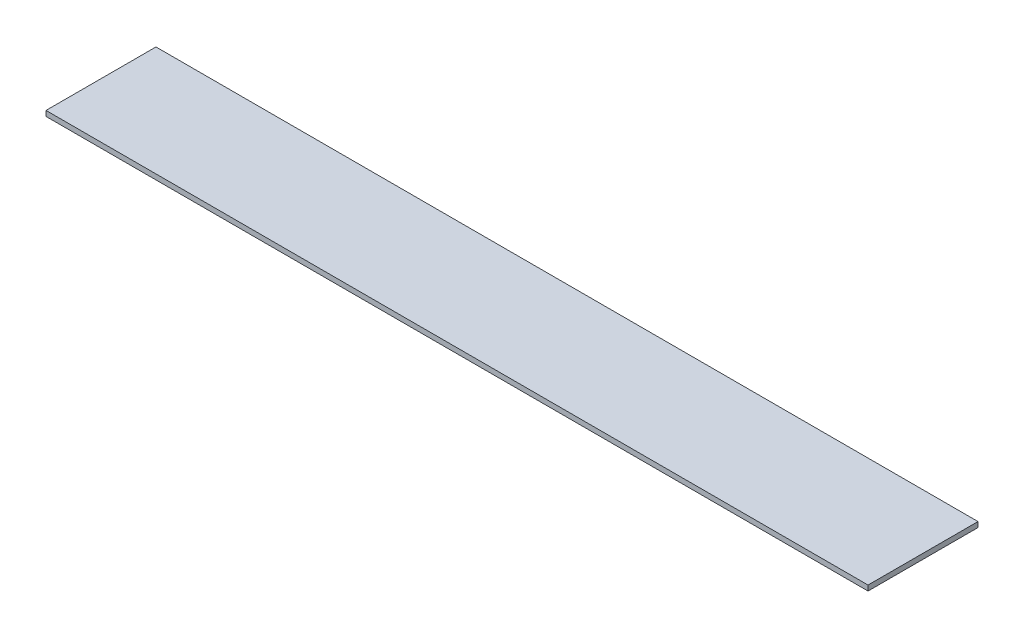
ISO-10303-21;
HEADER;
FILE_DESCRIPTION(('STEP AP214'),'2;1');
FILE_NAME('part.step','',(''),(''),'','','');
FILE_SCHEMA(('AUTOMOTIVE_DESIGN { 1 0 10303 214 1 1 1 1 }'));
ENDSEC;
DATA;
#1=APPLICATION_CONTEXT('core data for automotive mechanical design processes');
#2=APPLICATION_PROTOCOL_DEFINITION('international standard','automotive_design',2000,#1);
#3=PRODUCT_CONTEXT('',#1,'mechanical');
#4=PRODUCT('Part','Part','',(#3));
#5=PRODUCT_RELATED_PRODUCT_CATEGORY('part','',(#4));
#6=PRODUCT_DEFINITION_FORMATION('','',#4);
#7=PRODUCT_DEFINITION_CONTEXT('part definition',#1,'design');
#8=PRODUCT_DEFINITION('design','',#6,#7);
#9=PRODUCT_DEFINITION_SHAPE('','',#8);
#10=(LENGTH_UNIT() NAMED_UNIT(*) SI_UNIT(.MILLI.,.METRE.));
#11=(NAMED_UNIT(*) PLANE_ANGLE_UNIT() SI_UNIT($,.RADIAN.));
#12=(NAMED_UNIT(*) SI_UNIT($,.STERADIAN.) SOLID_ANGLE_UNIT());
#13=UNCERTAINTY_MEASURE_WITH_UNIT(LENGTH_MEASURE(1.E-05),#10,'distance_accuracy_value','');
#14=(GEOMETRIC_REPRESENTATION_CONTEXT(3) GLOBAL_UNCERTAINTY_ASSIGNED_CONTEXT((#13)) GLOBAL_UNIT_ASSIGNED_CONTEXT((#10,
#11,#12)) REPRESENTATION_CONTEXT('',''));
#15=CARTESIAN_POINT('',(0.,0.,0.));
#16=DIRECTION('',(0.,0.,1.));
#17=DIRECTION('',(1.,0.,0.));
#18=AXIS2_PLACEMENT_3D('',#15,#16,#17);
#19=CARTESIAN_POINT('',(0.,1.,-21.));
#20=DIRECTION('',(1.,0.,0.));
#21=DIRECTION('',(0.,0.,-1.));
#22=AXIS2_PLACEMENT_3D('',#19,#20,#21);
#23=PLANE('',#22);
#24=DIRECTION('',(0.,0.,1.));
#25=VECTOR('',#24,1.);
#26=CARTESIAN_POINT('',(0.,0.,-21.));
#27=LINE('',#26,#25);
#28=CARTESIAN_POINT('',(0.,0.,-21.));
#29=VERTEX_POINT('',#28);
#30=CARTESIAN_POINT('',(0.,0.,0.));
#31=VERTEX_POINT('',#30);
#32=EDGE_CURVE('E99',#29,#31,#27,.T.);
#33=ORIENTED_EDGE('',*,*,#32,.F.);
#34=DIRECTION('',(0.,-1.,0.));
#35=VECTOR('',#34,1.);
#36=CARTESIAN_POINT('',(0.,1.,-21.));
#37=LINE('',#36,#35);
#38=CARTESIAN_POINT('',(0.,1.,-21.));
#39=VERTEX_POINT('',#38);
#40=EDGE_CURVE('E11',#39,#29,#37,.T.);
#41=ORIENTED_EDGE('',*,*,#40,.F.);
#42=DIRECTION('',(0.,0.,1.));
#43=VECTOR('',#42,1.);
#44=CARTESIAN_POINT('',(0.,1.,-21.));
#45=LINE('',#44,#43);
#46=CARTESIAN_POINT('',(0.,1.,0.));
#47=VERTEX_POINT('',#46);
#48=EDGE_CURVE('E93',#39,#47,#45,.T.);
#49=ORIENTED_EDGE('',*,*,#48,.T.);
#50=DIRECTION('',(0.,-1.,0.));
#51=VECTOR('',#50,1.);
#52=CARTESIAN_POINT('',(0.,1.,0.));
#53=LINE('',#52,#51);
#54=EDGE_CURVE('E38',#47,#31,#53,.T.);
#55=ORIENTED_EDGE('',*,*,#54,.T.);
#56=EDGE_LOOP('',(#33,#41,#49,#55));
#57=FACE_BOUND('',#56,.T.);
#58=ADVANCED_FACE('F35',(#57),#23,.T.);
#59=CARTESIAN_POINT('',(-157.,1.,-21.));
#60=DIRECTION('',(0.,0.,-1.));
#61=DIRECTION('',(-1.,0.,0.));
#62=AXIS2_PLACEMENT_3D('',#59,#60,#61);
#63=PLANE('',#62);
#64=DIRECTION('',(1.,0.,0.));
#65=VECTOR('',#64,1.);
#66=CARTESIAN_POINT('',(-157.,0.,-21.));
#67=LINE('',#66,#65);
#68=CARTESIAN_POINT('',(-157.,0.,-21.));
#69=VERTEX_POINT('',#68);
#70=EDGE_CURVE('E95',#69,#29,#67,.T.);
#71=ORIENTED_EDGE('',*,*,#70,.F.);
#72=DIRECTION('',(0.,-1.,0.));
#73=VECTOR('',#72,1.);
#74=CARTESIAN_POINT('',(-157.,1.,-21.));
#75=LINE('',#74,#73);
#76=CARTESIAN_POINT('',(-157.,1.,-21.));
#77=VERTEX_POINT('',#76);
#78=EDGE_CURVE('E44',#77,#69,#75,.T.);
#79=ORIENTED_EDGE('',*,*,#78,.F.);
#80=DIRECTION('',(1.,0.,0.));
#81=VECTOR('',#80,1.);
#82=CARTESIAN_POINT('',(-157.,1.,-21.));
#83=LINE('',#82,#81);
#84=EDGE_CURVE('E90',#77,#39,#83,.T.);
#85=ORIENTED_EDGE('',*,*,#84,.T.);
#86=ORIENTED_EDGE('',*,*,#40,.T.);
#87=EDGE_LOOP('',(#71,#79,#85,#86));
#88=FACE_BOUND('',#87,.T.);
#89=ADVANCED_FACE('F109',(#88),#63,.T.);
#90=CARTESIAN_POINT('',(-157.,1.,0.));
#91=DIRECTION('',(-1.,0.,0.));
#92=DIRECTION('',(0.,0.,1.));
#93=AXIS2_PLACEMENT_3D('',#90,#91,#92);
#94=PLANE('',#93);
#95=DIRECTION('',(0.,0.,-1.));
#96=VECTOR('',#95,1.);
#97=CARTESIAN_POINT('',(-157.,0.,0.));
#98=LINE('',#97,#96);
#99=CARTESIAN_POINT('',(-157.,0.,0.));
#100=VERTEX_POINT('',#99);
#101=EDGE_CURVE('E85',#100,#69,#98,.T.);
#102=ORIENTED_EDGE('',*,*,#101,.F.);
#103=DIRECTION('',(0.,-1.,0.));
#104=VECTOR('',#103,1.);
#105=CARTESIAN_POINT('',(-157.,1.,0.));
#106=LINE('',#105,#104);
#107=CARTESIAN_POINT('',(-157.,1.,0.));
#108=VERTEX_POINT('',#107);
#109=EDGE_CURVE('E80',#108,#100,#106,.T.);
#110=ORIENTED_EDGE('',*,*,#109,.F.);
#111=DIRECTION('',(0.,0.,-1.));
#112=VECTOR('',#111,1.);
#113=CARTESIAN_POINT('',(-157.,1.,0.));
#114=LINE('',#113,#112);
#115=EDGE_CURVE('E83',#108,#77,#114,.T.);
#116=ORIENTED_EDGE('',*,*,#115,.T.);
#117=ORIENTED_EDGE('',*,*,#78,.T.);
#118=EDGE_LOOP('',(#102,#110,#116,#117));
#119=FACE_BOUND('',#118,.T.);
#120=ADVANCED_FACE('F82',(#119),#94,.T.);
#121=CARTESIAN_POINT('',(0.,1.,0.));
#122=DIRECTION('',(0.,0.,1.));
#123=DIRECTION('',(1.,0.,0.));
#124=AXIS2_PLACEMENT_3D('',#121,#122,#123);
#125=PLANE('',#124);
#126=DIRECTION('',(-1.,0.,0.));
#127=VECTOR('',#126,1.);
#128=CARTESIAN_POINT('',(0.,0.,0.));
#129=LINE('',#128,#127);
#130=EDGE_CURVE('E102',#31,#100,#129,.T.);
#131=ORIENTED_EDGE('',*,*,#130,.F.);
#132=ORIENTED_EDGE('',*,*,#54,.F.);
#133=DIRECTION('',(-1.,0.,0.));
#134=VECTOR('',#133,1.);
#135=CARTESIAN_POINT('',(0.,1.,0.));
#136=LINE('',#135,#134);
#137=EDGE_CURVE('E89',#47,#108,#136,.T.);
#138=ORIENTED_EDGE('',*,*,#137,.T.);
#139=ORIENTED_EDGE('',*,*,#109,.T.);
#140=EDGE_LOOP('',(#131,#132,#138,#139));
#141=FACE_BOUND('',#140,.T.);
#142=ADVANCED_FACE('F92',(#141),#125,.T.);
#143=CARTESIAN_POINT('',(0.,1.,0.));
#144=DIRECTION('',(0.,-1.,0.));
#145=DIRECTION('',(0.,0.,-1.));
#146=AXIS2_PLACEMENT_3D('',#143,#144,#145);
#147=PLANE('',#146);
#148=ORIENTED_EDGE('',*,*,#48,.F.);
#149=ORIENTED_EDGE('',*,*,#84,.F.);
#150=ORIENTED_EDGE('',*,*,#115,.F.);
#151=ORIENTED_EDGE('',*,*,#137,.F.);
#152=EDGE_LOOP('',(#148,#149,#150,#151));
#153=FACE_BOUND('',#152,.T.);
#154=ADVANCED_FACE('F88',(#153),#147,.F.);
#155=CARTESIAN_POINT('',(0.,0.,0.));
#156=DIRECTION('',(0.,-1.,0.));
#157=DIRECTION('',(0.,0.,-1.));
#158=AXIS2_PLACEMENT_3D('',#155,#156,#157);
#159=PLANE('',#158);
#160=ORIENTED_EDGE('',*,*,#32,.T.);
#161=ORIENTED_EDGE('',*,*,#130,.T.);
#162=ORIENTED_EDGE('',*,*,#101,.T.);
#163=ORIENTED_EDGE('',*,*,#70,.T.);
#164=EDGE_LOOP('',(#160,#161,#162,#163));
#165=FACE_BOUND('',#164,.T.);
#166=ADVANCED_FACE('F108',(#165),#159,.T.);
#167=CLOSED_SHELL('',(#58,#89,#120,#142,#154,#166));
#168=MANIFOLD_SOLID_BREP('B2',#167);
#169=ADVANCED_BREP_SHAPE_REPRESENTATION('',(#18,#168),#14);
#170=SHAPE_DEFINITION_REPRESENTATION(#9,#169);
ENDSEC;
END-ISO-10303-21;
